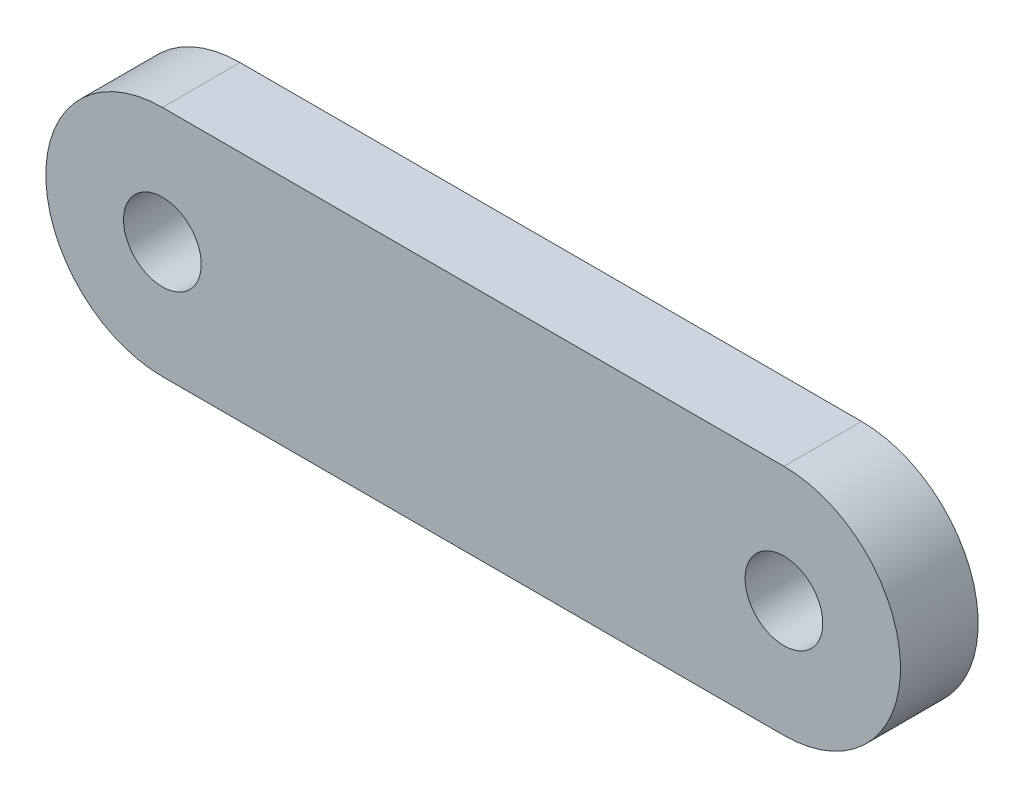
ISO-10303-21;
HEADER;
FILE_DESCRIPTION(('STEP AP214'),'2;1');
FILE_NAME('part.step','',(''),(''),'','','');
FILE_SCHEMA(('AUTOMOTIVE_DESIGN { 1 0 10303 214 1 1 1 1 }'));
ENDSEC;
DATA;
#1=APPLICATION_CONTEXT('core data for automotive mechanical design processes');
#2=APPLICATION_PROTOCOL_DEFINITION('international standard','automotive_design',2000,#1);
#3=PRODUCT_CONTEXT('',#1,'mechanical');
#4=PRODUCT('Part','Part','',(#3));
#5=PRODUCT_RELATED_PRODUCT_CATEGORY('part','',(#4));
#6=PRODUCT_DEFINITION_FORMATION('','',#4);
#7=PRODUCT_DEFINITION_CONTEXT('part definition',#1,'design');
#8=PRODUCT_DEFINITION('design','',#6,#7);
#9=PRODUCT_DEFINITION_SHAPE('','',#8);
#10=(LENGTH_UNIT() NAMED_UNIT(*) SI_UNIT(.MILLI.,.METRE.));
#11=(NAMED_UNIT(*) PLANE_ANGLE_UNIT() SI_UNIT($,.RADIAN.));
#12=(NAMED_UNIT(*) SI_UNIT($,.STERADIAN.) SOLID_ANGLE_UNIT());
#13=UNCERTAINTY_MEASURE_WITH_UNIT(LENGTH_MEASURE(1.E-05),#10,'distance_accuracy_value','');
#14=(GEOMETRIC_REPRESENTATION_CONTEXT(3) GLOBAL_UNCERTAINTY_ASSIGNED_CONTEXT((#13)) GLOBAL_UNIT_ASSIGNED_CONTEXT((#10,
#11,#12)) REPRESENTATION_CONTEXT('',''));
#15=CARTESIAN_POINT('',(0.,0.,0.));
#16=DIRECTION('',(0.,0.,1.));
#17=DIRECTION('',(1.,0.,0.));
#18=AXIS2_PLACEMENT_3D('',#15,#16,#17);
#19=CARTESIAN_POINT('',(0.,-4.7625,3.175));
#20=DIRECTION('',(0.,1.,0.));
#21=DIRECTION('',(-1.,0.,0.));
#22=AXIS2_PLACEMENT_3D('',#19,#20,#21);
#23=PLANE('',#22);
#24=DIRECTION('',(1.,0.,0.));
#25=VECTOR('',#24,1.);
#26=CARTESIAN_POINT('',(0.,-4.7625,0.));
#27=LINE('',#26,#25);
#28=CARTESIAN_POINT('',(0.,-4.7625,0.));
#29=VERTEX_POINT('',#28);
#30=CARTESIAN_POINT('',(25.4,-4.76250000000004,0.));
#31=VERTEX_POINT('',#30);
#32=EDGE_CURVE('E105',#29,#31,#27,.T.);
#33=ORIENTED_EDGE('',*,*,#32,.T.);
#34=DIRECTION('',(0.,0.,-0.999999999999993));
#35=VECTOR('',#34,1.);
#36=CARTESIAN_POINT('',(25.4,-4.76250000000004,3.175));
#37=LINE('',#36,#35);
#38=CARTESIAN_POINT('',(25.4,-4.76250000000004,3.175));
#39=VERTEX_POINT('',#38);
#40=EDGE_CURVE('E11',#39,#31,#37,.T.);
#41=ORIENTED_EDGE('',*,*,#40,.F.);
#42=DIRECTION('',(1.,0.,0.));
#43=VECTOR('',#42,1.);
#44=CARTESIAN_POINT('',(0.,-4.7625,3.175));
#45=LINE('',#44,#43);
#46=CARTESIAN_POINT('',(0.,-4.7625,3.175));
#47=VERTEX_POINT('',#46);
#48=EDGE_CURVE('E84',#47,#39,#45,.T.);
#49=ORIENTED_EDGE('',*,*,#48,.F.);
#50=DIRECTION('',(0.,0.,-0.999999999999993));
#51=VECTOR('',#50,1.);
#52=CARTESIAN_POINT('',(0.,-4.7625,3.175));
#53=LINE('',#52,#51);
#54=EDGE_CURVE('E104',#47,#29,#53,.T.);
#55=ORIENTED_EDGE('',*,*,#54,.T.);
#56=EDGE_LOOP('',(#33,#41,#49,#55));
#57=FACE_BOUND('',#56,.T.);
#58=ADVANCED_FACE('F36',(#57),#23,.F.);
#59=CARTESIAN_POINT('',(25.4,0.,3.175));
#60=DIRECTION('',(0.,0.,-0.999999999999993));
#61=DIRECTION('',(-1.,0.,0.));
#62=AXIS2_PLACEMENT_3D('',#59,#60,#61);
#63=CYLINDRICAL_SURFACE('',#62,4.7625);
#64=CARTESIAN_POINT('',(25.4,0.,0.));
#65=DIRECTION('',(0.,0.,0.999999999999993));
#66=DIRECTION('',(1.,0.,0.));
#67=AXIS2_PLACEMENT_3D('',#64,#65,#66);
#68=CIRCLE('',#67,4.7625);
#69=CARTESIAN_POINT('',(25.4,4.7625,0.));
#70=VERTEX_POINT('',#69);
#71=EDGE_CURVE('E89',#31,#70,#68,.T.);
#72=ORIENTED_EDGE('',*,*,#71,.T.);
#73=DIRECTION('',(0.,0.,-0.999999999999993));
#74=VECTOR('',#73,1.);
#75=CARTESIAN_POINT('',(25.4,4.7625,3.175));
#76=LINE('',#75,#74);
#77=CARTESIAN_POINT('',(25.4,4.7625,3.175));
#78=VERTEX_POINT('',#77);
#79=EDGE_CURVE('E44',#78,#70,#76,.T.);
#80=ORIENTED_EDGE('',*,*,#79,.F.);
#81=CARTESIAN_POINT('',(25.4,0.,3.175));
#82=DIRECTION('',(0.,0.,0.999999999999993));
#83=DIRECTION('',(1.,0.,0.));
#84=AXIS2_PLACEMENT_3D('',#81,#82,#83);
#85=CIRCLE('',#84,4.7625);
#86=EDGE_CURVE('E78',#39,#78,#85,.T.);
#87=ORIENTED_EDGE('',*,*,#86,.F.);
#88=ORIENTED_EDGE('',*,*,#40,.T.);
#89=EDGE_LOOP('',(#72,#80,#87,#88));
#90=FACE_BOUND('',#89,.T.);
#91=ADVANCED_FACE('F88',(#90),#63,.T.);
#92=CARTESIAN_POINT('',(0.,4.7625,3.175));
#93=DIRECTION('',(0.,1.,0.));
#94=DIRECTION('',(-1.,0.,0.));
#95=AXIS2_PLACEMENT_3D('',#92,#93,#94);
#96=PLANE('',#95);
#97=DIRECTION('',(1.,0.,0.));
#98=VECTOR('',#97,1.);
#99=CARTESIAN_POINT('',(0.,4.7625,0.));
#100=LINE('',#99,#98);
#101=CARTESIAN_POINT('',(0.,4.7625,0.));
#102=VERTEX_POINT('',#101);
#103=EDGE_CURVE('E109',#102,#70,#100,.T.);
#104=ORIENTED_EDGE('',*,*,#103,.F.);
#105=DIRECTION('',(0.,0.,-0.999999999999993));
#106=VECTOR('',#105,1.);
#107=CARTESIAN_POINT('',(0.,4.7625,3.175));
#108=LINE('',#107,#106);
#109=CARTESIAN_POINT('',(0.,4.7625,3.175));
#110=VERTEX_POINT('',#109);
#111=EDGE_CURVE('E68',#110,#102,#108,.T.);
#112=ORIENTED_EDGE('',*,*,#111,.F.);
#113=DIRECTION('',(1.,0.,0.));
#114=VECTOR('',#113,1.);
#115=CARTESIAN_POINT('',(0.,4.7625,3.175));
#116=LINE('',#115,#114);
#117=EDGE_CURVE('E82',#110,#78,#116,.T.);
#118=ORIENTED_EDGE('',*,*,#117,.T.);
#119=ORIENTED_EDGE('',*,*,#79,.T.);
#120=EDGE_LOOP('',(#104,#112,#118,#119));
#121=FACE_BOUND('',#120,.T.);
#122=ADVANCED_FACE('F93',(#121),#96,.T.);
#123=CARTESIAN_POINT('',(0.,0.,3.175));
#124=DIRECTION('',(0.,0.,-0.999999999999993));
#125=DIRECTION('',(-1.,0.,0.));
#126=AXIS2_PLACEMENT_3D('',#123,#124,#125);
#127=CYLINDRICAL_SURFACE('',#126,1.5875);
#128=CARTESIAN_POINT('',(0.,0.,3.175));
#129=DIRECTION('',(0.,0.,0.999999999999993));
#130=DIRECTION('',(1.,0.,0.));
#131=AXIS2_PLACEMENT_3D('',#128,#129,#130);
#132=CIRCLE('',#131,1.5875);
#133=CARTESIAN_POINT('',(-1.5875,0.,3.175));
#134=VERTEX_POINT('',#133);
#135=EDGE_CURVE('E95',#134,#134,#132,.T.);
#136=CARTESIAN_POINT('',(0.,0.,0.));
#137=DIRECTION('',(0.,0.,0.999999999999993));
#138=DIRECTION('',(1.,0.,0.));
#139=AXIS2_PLACEMENT_3D('',#136,#137,#138);
#140=CIRCLE('',#139,1.5875);
#141=CARTESIAN_POINT('',(-1.5875,0.,0.));
#142=VERTEX_POINT('',#141);
#143=EDGE_CURVE('E112',#142,#142,#140,.T.);
#144=CARTESIAN_POINT('',(-1.5875,0.,3.175));
#145=CARTESIAN_POINT('',(-1.5875,0.,3.14192708333333));
#146=CARTESIAN_POINT('',(-1.5875,0.,3.10885416666666));
#147=CARTESIAN_POINT('',(-1.5875,0.,3.04270833333333));
#148=CARTESIAN_POINT('',(-1.5875,0.,3.00963541666666));
#149=CARTESIAN_POINT('',(-1.5875,0.,2.94348958333333));
#150=CARTESIAN_POINT('',(-1.5875,0.,2.91041666666666));
#151=CARTESIAN_POINT('',(-1.5875,0.,2.84427083333333));
#152=CARTESIAN_POINT('',(-1.5875,0.,2.81119791666666));
#153=CARTESIAN_POINT('',(-1.5875,0.,2.74505208333333));
#154=CARTESIAN_POINT('',(-1.5875,0.,2.71197916666666));
#155=CARTESIAN_POINT('',(-1.5875,0.,2.64583333333333));
#156=CARTESIAN_POINT('',(-1.5875,0.,2.61276041666666));
#157=CARTESIAN_POINT('',(-1.5875,0.,2.54661458333333));
#158=CARTESIAN_POINT('',(-1.5875,0.,2.51354166666667));
#159=CARTESIAN_POINT('',(-1.5875,0.,2.44739583333333));
#160=CARTESIAN_POINT('',(-1.5875,0.,2.41432291666667));
#161=CARTESIAN_POINT('',(-1.5875,0.,2.34817708333333));
#162=CARTESIAN_POINT('',(-1.5875,0.,2.31510416666667));
#163=CARTESIAN_POINT('',(-1.5875,0.,2.24895833333333));
#164=CARTESIAN_POINT('',(-1.5875,0.,2.21588541666666));
#165=CARTESIAN_POINT('',(-1.5875,0.,2.14973958333333));
#166=CARTESIAN_POINT('',(-1.5875,0.,2.11666666666666));
#167=CARTESIAN_POINT('',(-1.5875,0.,2.05052083333333));
#168=CARTESIAN_POINT('',(-1.5875,0.,2.01744791666667));
#169=CARTESIAN_POINT('',(-1.5875,0.,1.95130208333333));
#170=CARTESIAN_POINT('',(-1.5875,0.,1.91822916666667));
#171=CARTESIAN_POINT('',(-1.5875,0.,1.85208333333333));
#172=CARTESIAN_POINT('',(-1.5875,0.,1.81901041666667));
#173=CARTESIAN_POINT('',(-1.5875,0.,1.75286458333333));
#174=CARTESIAN_POINT('',(-1.5875,0.,1.71979166666667));
#175=CARTESIAN_POINT('',(-1.5875,0.,1.65364583333333));
#176=CARTESIAN_POINT('',(-1.5875,0.,1.62057291666667));
#177=CARTESIAN_POINT('',(-1.5875,0.,1.55442708333333));
#178=CARTESIAN_POINT('',(-1.5875,0.,1.52135416666667));
#179=CARTESIAN_POINT('',(-1.5875,0.,1.45520833333333));
#180=CARTESIAN_POINT('',(-1.5875,0.,1.42213541666667));
#181=CARTESIAN_POINT('',(-1.5875,0.,1.35598958333333));
#182=CARTESIAN_POINT('',(-1.5875,0.,1.32291666666667));
#183=CARTESIAN_POINT('',(-1.5875,0.,1.25677083333333));
#184=CARTESIAN_POINT('',(-1.5875,0.,1.22369791666667));
#185=CARTESIAN_POINT('',(-1.5875,0.,1.15755208333333));
#186=CARTESIAN_POINT('',(-1.5875,0.,1.12447916666667));
#187=CARTESIAN_POINT('',(-1.5875,0.,1.05833333333333));
#188=CARTESIAN_POINT('',(-1.5875,0.,1.02526041666667));
#189=CARTESIAN_POINT('',(-1.5875,0.,0.959114583333333));
#190=CARTESIAN_POINT('',(-1.5875,0.,0.926041666666666));
#191=CARTESIAN_POINT('',(-1.5875,0.,0.859895833333333));
#192=CARTESIAN_POINT('',(-1.5875,0.,0.826822916666666));
#193=CARTESIAN_POINT('',(-1.5875,0.,0.760677083333333));
#194=CARTESIAN_POINT('',(-1.5875,0.,0.727604166666666));
#195=CARTESIAN_POINT('',(-1.5875,0.,0.661458333333333));
#196=CARTESIAN_POINT('',(-1.5875,0.,0.628385416666666));
#197=CARTESIAN_POINT('',(-1.5875,0.,0.562239583333333));
#198=CARTESIAN_POINT('',(-1.5875,0.,0.529166666666666));
#199=CARTESIAN_POINT('',(-1.5875,0.,0.463020833333333));
#200=CARTESIAN_POINT('',(-1.5875,0.,0.429947916666666));
#201=CARTESIAN_POINT('',(-1.5875,0.,0.363802083333333));
#202=CARTESIAN_POINT('',(-1.5875,0.,0.330729166666666));
#203=CARTESIAN_POINT('',(-1.5875,0.,0.264583333333333));
#204=CARTESIAN_POINT('',(-1.5875,0.,0.231510416666666));
#205=CARTESIAN_POINT('',(-1.5875,0.,0.165364583333333));
#206=CARTESIAN_POINT('',(-1.5875,0.,0.132291666666667));
#207=CARTESIAN_POINT('',(-1.5875,0.,0.0661458333333333));
#208=CARTESIAN_POINT('',(-1.5875,0.,0.0330729166666666));
#209=CARTESIAN_POINT('',(-1.5875,0.,0.));
#210=B_SPLINE_CURVE_WITH_KNOTS('',3,(#144,#145,#146,#147,#148,#149,#150,#151,#152,#153,#154,
#155,#156,#157,#158,#159,#160,#161,#162,#163,#164,#165,#166,#167,#168,#169,#170,#171,#172,#173,
#174,#175,#176,#177,#178,#179,#180,#181,#182,#183,#184,#185,#186,#187,#188,#189,#190,#191,#192,
#193,#194,#195,#196,#197,#198,#199,#200,#201,#202,#203,#204,#205,#206,#207,#208,#209),
.UNSPECIFIED.,.F.,.F.,(4,2,2,2,2,2,2,2,2,2,2,2,2,2,2,2,2,2,2,2,2,2,2,2,2,2,2,2,2,2,2,2,4),(0.,
0.0992187499999995,0.1984375,0.297656249999999,0.396875,0.496093749999999,0.595312499999999,
0.694531249999999,0.793749999999999,0.892968749999999,0.992187499999999,1.09140625,1.190625,
1.28984375,1.3890625,1.48828125,1.5875,1.68671875,1.7859375,1.88515625,1.984375,2.08359375,
2.1828125,2.28203125,2.38125,2.48046875,2.5796875,2.67890625,2.778125,2.87734375,2.9765625,
3.07578125,3.175),.UNSPECIFIED.);
#211=EDGE_CURVE('BSEAM140',#134,#142,#210,.T.);
#212=ORIENTED_EDGE('',*,*,#135,.T.);
#213=ORIENTED_EDGE('',*,*,#143,.F.);
#214=ORIENTED_EDGE('',*,*,#211,.T.);
#215=ORIENTED_EDGE('',*,*,#211,.F.);
#216=EDGE_LOOP('',(#212,#214,#213,#215));
#217=FACE_BOUND('',#216,.T.);
#218=ADVANCED_FACE('F140',(#217),#127,.F.);
#219=CARTESIAN_POINT('',(0.,0.,3.175));
#220=DIRECTION('',(0.,0.,-0.999999999999993));
#221=DIRECTION('',(-1.,0.,0.));
#222=AXIS2_PLACEMENT_3D('',#219,#220,#221);
#223=CYLINDRICAL_SURFACE('',#222,4.7625);
#224=CARTESIAN_POINT('',(0.,0.,0.));
#225=DIRECTION('',(0.,0.,0.999999999999993));
#226=DIRECTION('',(1.,0.,0.));
#227=AXIS2_PLACEMENT_3D('',#224,#225,#226);
#228=CIRCLE('',#227,4.7625);
#229=EDGE_CURVE('E71',#102,#29,#228,.T.);
#230=ORIENTED_EDGE('',*,*,#229,.T.);
#231=ORIENTED_EDGE('',*,*,#54,.F.);
#232=CARTESIAN_POINT('',(0.,0.,3.175));
#233=DIRECTION('',(0.,0.,0.999999999999993));
#234=DIRECTION('',(1.,0.,0.));
#235=AXIS2_PLACEMENT_3D('',#232,#233,#234);
#236=CIRCLE('',#235,4.7625);
#237=EDGE_CURVE('E52',#110,#47,#236,.T.);
#238=ORIENTED_EDGE('',*,*,#237,.F.);
#239=ORIENTED_EDGE('',*,*,#111,.T.);
#240=EDGE_LOOP('',(#230,#231,#238,#239));
#241=FACE_BOUND('',#240,.T.);
#242=ADVANCED_FACE('F132',(#241),#223,.T.);
#243=CARTESIAN_POINT('',(25.4,0.,3.175));
#244=DIRECTION('',(0.,0.,-0.999999999999993));
#245=DIRECTION('',(-1.,0.,0.));
#246=AXIS2_PLACEMENT_3D('',#243,#244,#245);
#247=CYLINDRICAL_SURFACE('',#246,1.58749999999998);
#248=CARTESIAN_POINT('',(25.4,0.,3.175));
#249=DIRECTION('',(0.,0.,0.999999999999993));
#250=DIRECTION('',(1.,0.,0.));
#251=AXIS2_PLACEMENT_3D('',#248,#249,#250);
#252=CIRCLE('',#251,1.58749999999998);
#253=CARTESIAN_POINT('',(23.8125,0.,3.175));
#254=VERTEX_POINT('',#253);
#255=EDGE_CURVE('E101',#254,#254,#252,.T.);
#256=CARTESIAN_POINT('',(25.4,0.,0.));
#257=DIRECTION('',(0.,0.,0.999999999999993));
#258=DIRECTION('',(1.,0.,0.));
#259=AXIS2_PLACEMENT_3D('',#256,#257,#258);
#260=CIRCLE('',#259,1.58749999999998);
#261=CARTESIAN_POINT('',(23.8125,0.,0.));
#262=VERTEX_POINT('',#261);
#263=EDGE_CURVE('E115',#262,#262,#260,.T.);
#264=CARTESIAN_POINT('',(23.8125,0.,3.175));
#265=CARTESIAN_POINT('',(23.8125,0.,3.14192708333333));
#266=CARTESIAN_POINT('',(23.8125,0.,3.10885416666666));
#267=CARTESIAN_POINT('',(23.8125,0.,3.04270833333333));
#268=CARTESIAN_POINT('',(23.8125,0.,3.00963541666666));
#269=CARTESIAN_POINT('',(23.8125,0.,2.94348958333333));
#270=CARTESIAN_POINT('',(23.8125,0.,2.91041666666666));
#271=CARTESIAN_POINT('',(23.8125,0.,2.84427083333333));
#272=CARTESIAN_POINT('',(23.8125,0.,2.81119791666666));
#273=CARTESIAN_POINT('',(23.8125,0.,2.74505208333333));
#274=CARTESIAN_POINT('',(23.8125,0.,2.71197916666666));
#275=CARTESIAN_POINT('',(23.8125,0.,2.64583333333333));
#276=CARTESIAN_POINT('',(23.8125,0.,2.61276041666666));
#277=CARTESIAN_POINT('',(23.8125,0.,2.54661458333333));
#278=CARTESIAN_POINT('',(23.8125,0.,2.51354166666667));
#279=CARTESIAN_POINT('',(23.8125,0.,2.44739583333333));
#280=CARTESIAN_POINT('',(23.8125,0.,2.41432291666667));
#281=CARTESIAN_POINT('',(23.8125,0.,2.34817708333333));
#282=CARTESIAN_POINT('',(23.8125,0.,2.31510416666667));
#283=CARTESIAN_POINT('',(23.8125,0.,2.24895833333333));
#284=CARTESIAN_POINT('',(23.8125,0.,2.21588541666666));
#285=CARTESIAN_POINT('',(23.8125,0.,2.14973958333333));
#286=CARTESIAN_POINT('',(23.8125,0.,2.11666666666666));
#287=CARTESIAN_POINT('',(23.8125,0.,2.05052083333333));
#288=CARTESIAN_POINT('',(23.8125,0.,2.01744791666667));
#289=CARTESIAN_POINT('',(23.8125,0.,1.95130208333333));
#290=CARTESIAN_POINT('',(23.8125,0.,1.91822916666667));
#291=CARTESIAN_POINT('',(23.8125,0.,1.85208333333333));
#292=CARTESIAN_POINT('',(23.8125,0.,1.81901041666667));
#293=CARTESIAN_POINT('',(23.8125,0.,1.75286458333333));
#294=CARTESIAN_POINT('',(23.8125,0.,1.71979166666667));
#295=CARTESIAN_POINT('',(23.8125,0.,1.65364583333333));
#296=CARTESIAN_POINT('',(23.8125,0.,1.62057291666667));
#297=CARTESIAN_POINT('',(23.8125,0.,1.55442708333333));
#298=CARTESIAN_POINT('',(23.8125,0.,1.52135416666667));
#299=CARTESIAN_POINT('',(23.8125,0.,1.45520833333333));
#300=CARTESIAN_POINT('',(23.8125,0.,1.42213541666667));
#301=CARTESIAN_POINT('',(23.8125,0.,1.35598958333333));
#302=CARTESIAN_POINT('',(23.8125,0.,1.32291666666667));
#303=CARTESIAN_POINT('',(23.8125,0.,1.25677083333333));
#304=CARTESIAN_POINT('',(23.8125,0.,1.22369791666667));
#305=CARTESIAN_POINT('',(23.8125,0.,1.15755208333333));
#306=CARTESIAN_POINT('',(23.8125,0.,1.12447916666667));
#307=CARTESIAN_POINT('',(23.8125,0.,1.05833333333333));
#308=CARTESIAN_POINT('',(23.8125,0.,1.02526041666667));
#309=CARTESIAN_POINT('',(23.8125,0.,0.959114583333333));
#310=CARTESIAN_POINT('',(23.8125,0.,0.926041666666666));
#311=CARTESIAN_POINT('',(23.8125,0.,0.859895833333333));
#312=CARTESIAN_POINT('',(23.8125,0.,0.826822916666666));
#313=CARTESIAN_POINT('',(23.8125,0.,0.760677083333333));
#314=CARTESIAN_POINT('',(23.8125,0.,0.727604166666666));
#315=CARTESIAN_POINT('',(23.8125,0.,0.661458333333333));
#316=CARTESIAN_POINT('',(23.8125,0.,0.628385416666666));
#317=CARTESIAN_POINT('',(23.8125,0.,0.562239583333333));
#318=CARTESIAN_POINT('',(23.8125,0.,0.529166666666666));
#319=CARTESIAN_POINT('',(23.8125,0.,0.463020833333333));
#320=CARTESIAN_POINT('',(23.8125,0.,0.429947916666666));
#321=CARTESIAN_POINT('',(23.8125,0.,0.363802083333333));
#322=CARTESIAN_POINT('',(23.8125,0.,0.330729166666666));
#323=CARTESIAN_POINT('',(23.8125,0.,0.264583333333333));
#324=CARTESIAN_POINT('',(23.8125,0.,0.231510416666666));
#325=CARTESIAN_POINT('',(23.8125,0.,0.165364583333333));
#326=CARTESIAN_POINT('',(23.8125,0.,0.132291666666667));
#327=CARTESIAN_POINT('',(23.8125,0.,0.0661458333333333));
#328=CARTESIAN_POINT('',(23.8125,0.,0.0330729166666666));
#329=CARTESIAN_POINT('',(23.8125,0.,0.));
#330=B_SPLINE_CURVE_WITH_KNOTS('',3,(#264,#265,#266,#267,#268,#269,#270,#271,#272,#273,#274,
#275,#276,#277,#278,#279,#280,#281,#282,#283,#284,#285,#286,#287,#288,#289,#290,#291,#292,#293,
#294,#295,#296,#297,#298,#299,#300,#301,#302,#303,#304,#305,#306,#307,#308,#309,#310,#311,#312,
#313,#314,#315,#316,#317,#318,#319,#320,#321,#322,#323,#324,#325,#326,#327,#328,#329),
.UNSPECIFIED.,.F.,.F.,(4,2,2,2,2,2,2,2,2,2,2,2,2,2,2,2,2,2,2,2,2,2,2,2,2,2,2,2,2,2,2,2,4),(0.,
0.0992187499999995,0.1984375,0.297656249999999,0.396875,0.496093749999999,0.595312499999999,
0.694531249999999,0.793749999999999,0.892968749999999,0.992187499999999,1.09140625,1.190625,
1.28984375,1.3890625,1.48828125,1.5875,1.68671875,1.7859375,1.88515625,1.984375,2.08359375,
2.1828125,2.28203125,2.38125,2.48046875,2.5796875,2.67890625,2.778125,2.87734375,2.9765625,
3.07578125,3.175),.UNSPECIFIED.);
#331=EDGE_CURVE('BSEAM130',#254,#262,#330,.T.);
#332=ORIENTED_EDGE('',*,*,#255,.T.);
#333=ORIENTED_EDGE('',*,*,#263,.F.);
#334=ORIENTED_EDGE('',*,*,#331,.T.);
#335=ORIENTED_EDGE('',*,*,#331,.F.);
#336=EDGE_LOOP('',(#332,#334,#333,#335));
#337=FACE_BOUND('',#336,.T.);
#338=ADVANCED_FACE('F130',(#337),#247,.F.);
#339=CARTESIAN_POINT('',(0.,0.,3.175));
#340=DIRECTION('',(0.,0.,0.999999999999993));
#341=DIRECTION('',(1.,0.,0.));
#342=AXIS2_PLACEMENT_3D('',#339,#340,#341);
#343=PLANE('',#342);
#344=ORIENTED_EDGE('',*,*,#48,.T.);
#345=ORIENTED_EDGE('',*,*,#86,.T.);
#346=ORIENTED_EDGE('',*,*,#117,.F.);
#347=ORIENTED_EDGE('',*,*,#237,.T.);
#348=EDGE_LOOP('',(#344,#345,#346,#347));
#349=FACE_BOUND('',#348,.T.);
#350=ORIENTED_EDGE('',*,*,#135,.F.);
#351=EDGE_LOOP('',(#350));
#352=FACE_BOUND('',#351,.T.);
#353=ORIENTED_EDGE('',*,*,#255,.F.);
#354=EDGE_LOOP('',(#353));
#355=FACE_BOUND('',#354,.T.);
#356=ADVANCED_FACE('F79',(#349,#352,#355),#343,.T.);
#357=CARTESIAN_POINT('',(0.,0.,0.));
#358=DIRECTION('',(0.,0.,0.999999999999993));
#359=DIRECTION('',(1.,0.,0.));
#360=AXIS2_PLACEMENT_3D('',#357,#358,#359);
#361=PLANE('',#360);
#362=ORIENTED_EDGE('',*,*,#32,.F.);
#363=ORIENTED_EDGE('',*,*,#229,.F.);
#364=ORIENTED_EDGE('',*,*,#103,.T.);
#365=ORIENTED_EDGE('',*,*,#71,.F.);
#366=EDGE_LOOP('',(#362,#363,#364,#365));
#367=FACE_BOUND('',#366,.T.);
#368=ORIENTED_EDGE('',*,*,#143,.T.);
#369=EDGE_LOOP('',(#368));
#370=FACE_BOUND('',#369,.T.);
#371=ORIENTED_EDGE('',*,*,#263,.T.);
#372=EDGE_LOOP('',(#371));
#373=FACE_BOUND('',#372,.T.);
#374=ADVANCED_FACE('F122',(#367,#370,#373),#361,.F.);
#375=CLOSED_SHELL('',(#58,#91,#122,#218,#242,#338,#356,#374));
#376=MANIFOLD_SOLID_BREP('B2',#375);
#377=ADVANCED_BREP_SHAPE_REPRESENTATION('',(#18,#376),#14);
#378=SHAPE_DEFINITION_REPRESENTATION(#9,#377);
ENDSEC;
END-ISO-10303-21;
